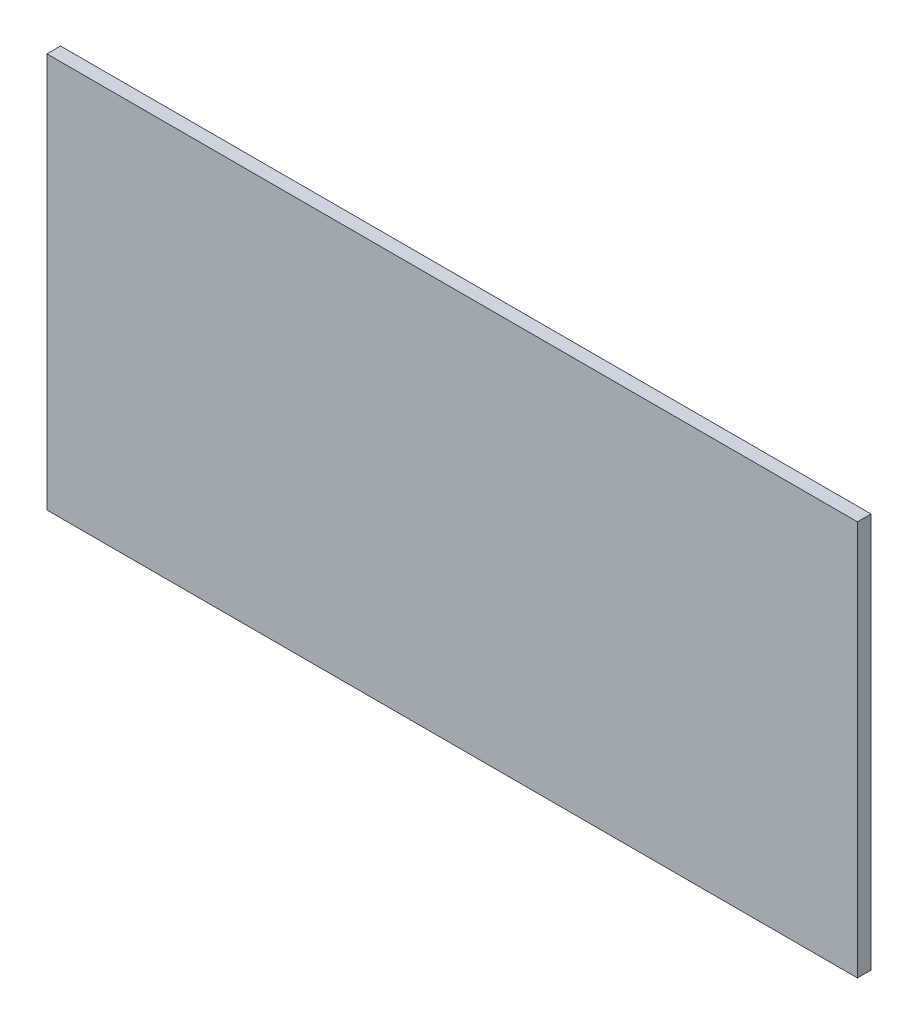
ISO-10303-21;
HEADER;
FILE_DESCRIPTION(('STEP AP214'),'2;1');
FILE_NAME('part.step','',(''),(''),'','','');
FILE_SCHEMA(('AUTOMOTIVE_DESIGN { 1 0 10303 214 1 1 1 1 }'));
ENDSEC;
DATA;
#1=APPLICATION_CONTEXT('core data for automotive mechanical design processes');
#2=APPLICATION_PROTOCOL_DEFINITION('international standard','automotive_design',2000,#1);
#3=PRODUCT_CONTEXT('',#1,'mechanical');
#4=PRODUCT('Part','Part','',(#3));
#5=PRODUCT_RELATED_PRODUCT_CATEGORY('part','',(#4));
#6=PRODUCT_DEFINITION_FORMATION('','',#4);
#7=PRODUCT_DEFINITION_CONTEXT('part definition',#1,'design');
#8=PRODUCT_DEFINITION('design','',#6,#7);
#9=PRODUCT_DEFINITION_SHAPE('','',#8);
#10=(LENGTH_UNIT() NAMED_UNIT(*) SI_UNIT(.MILLI.,.METRE.));
#11=(NAMED_UNIT(*) PLANE_ANGLE_UNIT() SI_UNIT($,.RADIAN.));
#12=(NAMED_UNIT(*) SI_UNIT($,.STERADIAN.) SOLID_ANGLE_UNIT());
#13=UNCERTAINTY_MEASURE_WITH_UNIT(LENGTH_MEASURE(1.E-05),#10,'distance_accuracy_value','');
#14=(GEOMETRIC_REPRESENTATION_CONTEXT(3) GLOBAL_UNCERTAINTY_ASSIGNED_CONTEXT((#13)) GLOBAL_UNIT_ASSIGNED_CONTEXT((#10,
#11,#12)) REPRESENTATION_CONTEXT('',''));
#15=CARTESIAN_POINT('',(0.,0.,0.));
#16=DIRECTION('',(0.,0.,1.));
#17=DIRECTION('',(1.,0.,0.));
#18=AXIS2_PLACEMENT_3D('',#15,#16,#17);
#19=CARTESIAN_POINT('',(297.5,145.,10.));
#20=DIRECTION('',(-1.,0.,0.));
#21=DIRECTION('',(0.,0.,1.));
#22=AXIS2_PLACEMENT_3D('',#19,#20,#21);
#23=PLANE('',#22);
#24=DIRECTION('',(0.,1.,0.));
#25=VECTOR('',#24,1.);
#26=CARTESIAN_POINT('',(297.5,145.,0.));
#27=LINE('',#26,#25);
#28=CARTESIAN_POINT('',(297.5,-145.,0.));
#29=VERTEX_POINT('',#28);
#30=CARTESIAN_POINT('',(297.5,145.,0.));
#31=VERTEX_POINT('',#30);
#32=EDGE_CURVE('E98',#29,#31,#27,.T.);
#33=ORIENTED_EDGE('',*,*,#32,.T.);
#34=DIRECTION('',(0.,0.,-1.));
#35=VECTOR('',#34,1.);
#36=CARTESIAN_POINT('',(297.5,145.,10.));
#37=LINE('',#36,#35);
#38=CARTESIAN_POINT('',(297.5,145.,10.));
#39=VERTEX_POINT('',#38);
#40=EDGE_CURVE('E11',#39,#31,#37,.T.);
#41=ORIENTED_EDGE('',*,*,#40,.F.);
#42=DIRECTION('',(0.,1.,0.));
#43=VECTOR('',#42,1.);
#44=CARTESIAN_POINT('',(297.5,145.,10.));
#45=LINE('',#44,#43);
#46=CARTESIAN_POINT('',(297.5,-145.,10.));
#47=VERTEX_POINT('',#46);
#48=EDGE_CURVE('E86',#47,#39,#45,.T.);
#49=ORIENTED_EDGE('',*,*,#48,.F.);
#50=DIRECTION('',(0.,0.,-1.));
#51=VECTOR('',#50,1.);
#52=CARTESIAN_POINT('',(297.5,-145.,10.));
#53=LINE('',#52,#51);
#54=EDGE_CURVE('E94',#47,#29,#53,.T.);
#55=ORIENTED_EDGE('',*,*,#54,.T.);
#56=EDGE_LOOP('',(#33,#41,#49,#55));
#57=FACE_BOUND('',#56,.T.);
#58=ADVANCED_FACE('F35',(#57),#23,.F.);
#59=CARTESIAN_POINT('',(-297.5,145.,10.));
#60=DIRECTION('',(0.,-1.,0.));
#61=DIRECTION('',(0.,0.,-1.));
#62=AXIS2_PLACEMENT_3D('',#59,#60,#61);
#63=PLANE('',#62);
#64=DIRECTION('',(-1.,0.,0.));
#65=VECTOR('',#64,1.);
#66=CARTESIAN_POINT('',(-297.5,145.,0.));
#67=LINE('',#66,#65);
#68=CARTESIAN_POINT('',(-297.5,145.,0.));
#69=VERTEX_POINT('',#68);
#70=EDGE_CURVE('E90',#31,#69,#67,.T.);
#71=ORIENTED_EDGE('',*,*,#70,.T.);
#72=DIRECTION('',(0.,0.,-1.));
#73=VECTOR('',#72,1.);
#74=CARTESIAN_POINT('',(-297.5,145.,10.));
#75=LINE('',#74,#73);
#76=CARTESIAN_POINT('',(-297.5,145.,10.));
#77=VERTEX_POINT('',#76);
#78=EDGE_CURVE('E43',#77,#69,#75,.T.);
#79=ORIENTED_EDGE('',*,*,#78,.F.);
#80=DIRECTION('',(-1.,0.,0.));
#81=VECTOR('',#80,1.);
#82=CARTESIAN_POINT('',(-297.5,145.,10.));
#83=LINE('',#82,#81);
#84=EDGE_CURVE('E81',#39,#77,#83,.T.);
#85=ORIENTED_EDGE('',*,*,#84,.F.);
#86=ORIENTED_EDGE('',*,*,#40,.T.);
#87=EDGE_LOOP('',(#71,#79,#85,#86));
#88=FACE_BOUND('',#87,.T.);
#89=ADVANCED_FACE('F89',(#88),#63,.F.);
#90=CARTESIAN_POINT('',(-297.5,145.,10.));
#91=DIRECTION('',(1.,0.,0.));
#92=DIRECTION('',(0.,1.,0.));
#93=AXIS2_PLACEMENT_3D('',#90,#91,#92);
#94=PLANE('',#93);
#95=DIRECTION('',(0.,-1.,0.));
#96=VECTOR('',#95,1.);
#97=CARTESIAN_POINT('',(-297.5,145.,0.));
#98=LINE('',#97,#96);
#99=CARTESIAN_POINT('',(-297.5,-145.,0.));
#100=VERTEX_POINT('',#99);
#101=EDGE_CURVE('E68',#69,#100,#98,.T.);
#102=ORIENTED_EDGE('',*,*,#101,.T.);
#103=DIRECTION('',(0.,0.,-1.));
#104=VECTOR('',#103,1.);
#105=CARTESIAN_POINT('',(-297.5,-145.,10.));
#106=LINE('',#105,#104);
#107=CARTESIAN_POINT('',(-297.5,-145.,10.));
#108=VERTEX_POINT('',#107);
#109=EDGE_CURVE('E91',#108,#100,#106,.T.);
#110=ORIENTED_EDGE('',*,*,#109,.F.);
#111=DIRECTION('',(0.,-1.,0.));
#112=VECTOR('',#111,1.);
#113=CARTESIAN_POINT('',(-297.5,145.,10.));
#114=LINE('',#113,#112);
#115=EDGE_CURVE('E84',#77,#108,#114,.T.);
#116=ORIENTED_EDGE('',*,*,#115,.F.);
#117=ORIENTED_EDGE('',*,*,#78,.T.);
#118=EDGE_LOOP('',(#102,#110,#116,#117));
#119=FACE_BOUND('',#118,.T.);
#120=ADVANCED_FACE('F92',(#119),#94,.F.);
#121=CARTESIAN_POINT('',(-297.5,-145.,10.));
#122=DIRECTION('',(0.,1.,0.));
#123=DIRECTION('',(0.,0.,1.));
#124=AXIS2_PLACEMENT_3D('',#121,#122,#123);
#125=PLANE('',#124);
#126=DIRECTION('',(1.,0.,0.));
#127=VECTOR('',#126,1.);
#128=CARTESIAN_POINT('',(-297.5,-145.,0.));
#129=LINE('',#128,#127);
#130=EDGE_CURVE('E74',#100,#29,#129,.T.);
#131=ORIENTED_EDGE('',*,*,#130,.T.);
#132=ORIENTED_EDGE('',*,*,#54,.F.);
#133=DIRECTION('',(1.,0.,0.));
#134=VECTOR('',#133,1.);
#135=CARTESIAN_POINT('',(-297.5,-145.,10.));
#136=LINE('',#135,#134);
#137=EDGE_CURVE('E51',#108,#47,#136,.T.);
#138=ORIENTED_EDGE('',*,*,#137,.F.);
#139=ORIENTED_EDGE('',*,*,#109,.T.);
#140=EDGE_LOOP('',(#131,#132,#138,#139));
#141=FACE_BOUND('',#140,.T.);
#142=ADVANCED_FACE('F105',(#141),#125,.F.);
#143=CARTESIAN_POINT('',(0.,0.,10.));
#144=DIRECTION('',(0.,0.,1.));
#145=DIRECTION('',(1.,0.,0.));
#146=AXIS2_PLACEMENT_3D('',#143,#144,#145);
#147=PLANE('',#146);
#148=ORIENTED_EDGE('',*,*,#48,.T.);
#149=ORIENTED_EDGE('',*,*,#84,.T.);
#150=ORIENTED_EDGE('',*,*,#115,.T.);
#151=ORIENTED_EDGE('',*,*,#137,.T.);
#152=EDGE_LOOP('',(#148,#149,#150,#151));
#153=FACE_BOUND('',#152,.T.);
#154=ADVANCED_FACE('F82',(#153),#147,.T.);
#155=CARTESIAN_POINT('',(0.,0.,0.));
#156=DIRECTION('',(0.,0.,1.));
#157=DIRECTION('',(1.,0.,0.));
#158=AXIS2_PLACEMENT_3D('',#155,#156,#157);
#159=PLANE('',#158);
#160=ORIENTED_EDGE('',*,*,#32,.F.);
#161=ORIENTED_EDGE('',*,*,#130,.F.);
#162=ORIENTED_EDGE('',*,*,#101,.F.);
#163=ORIENTED_EDGE('',*,*,#70,.F.);
#164=EDGE_LOOP('',(#160,#161,#162,#163));
#165=FACE_BOUND('',#164,.T.);
#166=ADVANCED_FACE('F108',(#165),#159,.F.);
#167=CLOSED_SHELL('',(#58,#89,#120,#142,#154,#166));
#168=MANIFOLD_SOLID_BREP('B2',#167);
#169=ADVANCED_BREP_SHAPE_REPRESENTATION('',(#18,#168),#14);
#170=SHAPE_DEFINITION_REPRESENTATION(#9,#169);
ENDSEC;
END-ISO-10303-21;
